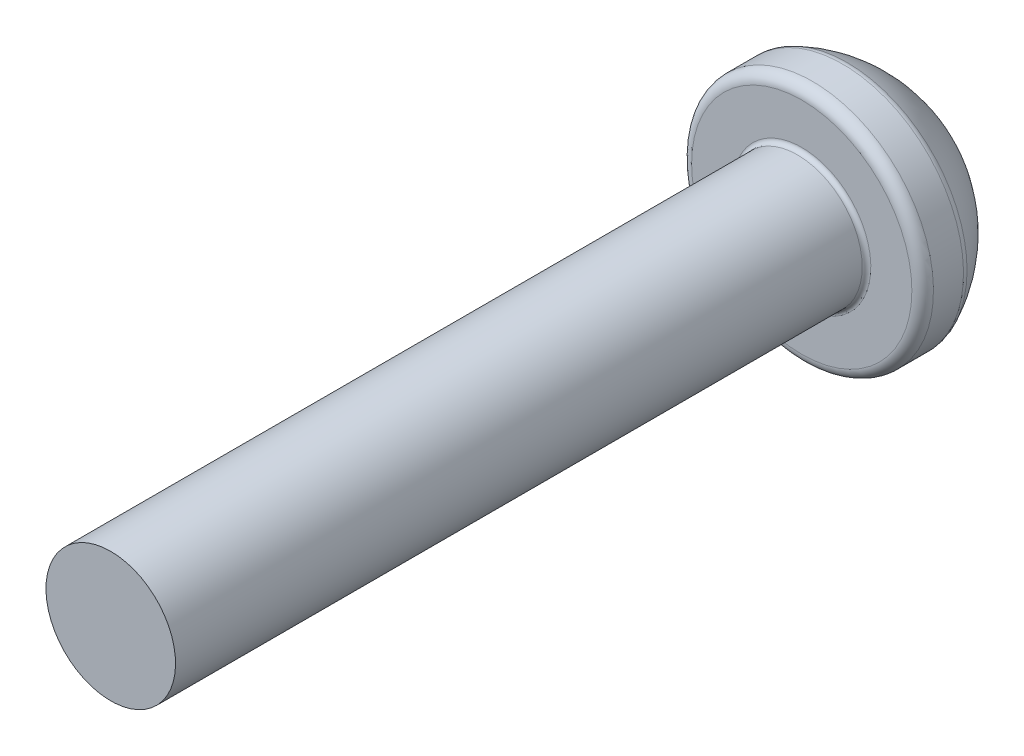
ISO-10303-21;
HEADER;
FILE_DESCRIPTION(('STEP AP214'),'2;1');
FILE_NAME('part.step','',(''),(''),'','','');
FILE_SCHEMA(('AUTOMOTIVE_DESIGN { 1 0 10303 214 1 1 1 1 }'));
ENDSEC;
DATA;
#1=APPLICATION_CONTEXT('core data for automotive mechanical design processes');
#2=APPLICATION_PROTOCOL_DEFINITION('international standard','automotive_design',2000,#1);
#3=PRODUCT_CONTEXT('',#1,'mechanical');
#4=PRODUCT('Part','Part','',(#3));
#5=PRODUCT_RELATED_PRODUCT_CATEGORY('part','',(#4));
#6=PRODUCT_DEFINITION_FORMATION('','',#4);
#7=PRODUCT_DEFINITION_CONTEXT('part definition',#1,'design');
#8=PRODUCT_DEFINITION('design','',#6,#7);
#9=PRODUCT_DEFINITION_SHAPE('','',#8);
#10=(LENGTH_UNIT() NAMED_UNIT(*) SI_UNIT(.MILLI.,.METRE.));
#11=(NAMED_UNIT(*) PLANE_ANGLE_UNIT() SI_UNIT($,.RADIAN.));
#12=(NAMED_UNIT(*) SI_UNIT($,.STERADIAN.) SOLID_ANGLE_UNIT());
#13=UNCERTAINTY_MEASURE_WITH_UNIT(LENGTH_MEASURE(1.E-05),#10,'distance_accuracy_value','');
#14=(GEOMETRIC_REPRESENTATION_CONTEXT(3) GLOBAL_UNCERTAINTY_ASSIGNED_CONTEXT((#13)) GLOBAL_UNIT_ASSIGNED_CONTEXT((#10,
#11,#12)) REPRESENTATION_CONTEXT('',''));
#15=CARTESIAN_POINT('',(0.,0.,0.));
#16=DIRECTION('',(0.,0.,1.));
#17=DIRECTION('',(1.,0.,0.));
#18=AXIS2_PLACEMENT_3D('',#15,#16,#17);
#19=CARTESIAN_POINT('',(0.,0.,16.));
#20=DIRECTION('',(0.,0.,1.));
#21=DIRECTION('',(0.,-1.,0.));
#22=AXIS2_PLACEMENT_3D('',#19,#20,#21);
#23=PLANE('',#22);
#24=CARTESIAN_POINT('',(0.,0.,16.));
#25=DIRECTION('',(0.,0.,-1.));
#26=DIRECTION('',(0.,1.,0.));
#27=AXIS2_PLACEMENT_3D('',#24,#25,#26);
#28=CIRCLE('',#27,1.5);
#29=CARTESIAN_POINT('',(0.,1.5,16.));
#30=VERTEX_POINT('',#29);
#31=EDGE_CURVE('E266',#30,#30,#28,.T.);
#32=ORIENTED_EDGE('',*,*,#31,.F.);
#33=EDGE_LOOP('',(#32));
#34=FACE_BOUND('',#33,.T.);
#35=ADVANCED_FACE('F34',(#34),#23,.T.);
#36=CARTESIAN_POINT('',(0.,0.,-2.4));
#37=DIRECTION('',(0.,0.,-1.));
#38=DIRECTION('',(0.,1.,0.));
#39=AXIS2_PLACEMENT_3D('',#36,#37,#38);
#40=CYLINDRICAL_SURFACE('',#39,1.5);
#41=CARTESIAN_POINT('',(0.,0.,0.0999999999999998));
#42=DIRECTION('',(0.,0.,1.));
#43=DIRECTION('',(0.,-1.,0.));
#44=AXIS2_PLACEMENT_3D('',#41,#42,#43);
#45=CIRCLE('',#44,1.5);
#46=CARTESIAN_POINT('',(0.,-1.5,0.0999999999999997));
#47=VERTEX_POINT('',#46);
#48=EDGE_CURVE('E272',#47,#47,#45,.T.);
#49=ORIENTED_EDGE('',*,*,#48,.T.);
#50=EDGE_LOOP('',(#49));
#51=FACE_BOUND('',#50,.T.);
#52=ORIENTED_EDGE('',*,*,#31,.T.);
#53=EDGE_LOOP('',(#52));
#54=FACE_BOUND('',#53,.T.);
#55=ADVANCED_FACE('F307',(#51,#54),#40,.T.);
#56=CARTESIAN_POINT('',(0.,1.5,0.));
#57=DIRECTION('',(0.,0.,1.));
#58=DIRECTION('',(0.,-1.,0.));
#59=AXIS2_PLACEMENT_3D('',#56,#57,#58);
#60=PLANE('',#59);
#61=CARTESIAN_POINT('',(0.,0.,0.));
#62=DIRECTION('',(0.,0.,1.));
#63=DIRECTION('',(0.,-1.,0.));
#64=AXIS2_PLACEMENT_3D('',#61,#62,#63);
#65=CIRCLE('',#64,2.55);
#66=CARTESIAN_POINT('',(0.,-2.55,0.));
#67=VERTEX_POINT('',#66);
#68=EDGE_CURVE('E11',#67,#67,#65,.T.);
#69=ORIENTED_EDGE('',*,*,#68,.T.);
#70=EDGE_LOOP('',(#69));
#71=FACE_BOUND('',#70,.T.);
#72=CARTESIAN_POINT('',(0.,0.,0.));
#73=DIRECTION('',(0.,0.,1.));
#74=DIRECTION('',(0.,-1.,0.));
#75=AXIS2_PLACEMENT_3D('',#72,#73,#74);
#76=CIRCLE('',#75,1.6);
#77=CARTESIAN_POINT('',(0.,-1.6,0.));
#78=VERTEX_POINT('',#77);
#79=EDGE_CURVE('E269',#78,#78,#76,.F.);
#80=ORIENTED_EDGE('',*,*,#79,.T.);
#81=EDGE_LOOP('',(#80));
#82=FACE_BOUND('',#81,.T.);
#83=ADVANCED_FACE('F312',(#71,#82),#60,.T.);
#84=CARTESIAN_POINT('',(0.,0.,-2.4));
#85=DIRECTION('',(0.,0.,-1.));
#86=DIRECTION('',(0.,1.,0.));
#87=AXIS2_PLACEMENT_3D('',#84,#85,#86);
#88=CYLINDRICAL_SURFACE('',#87,2.8);
#89=CARTESIAN_POINT('',(0.,0.,-0.945424841825028));
#90=DIRECTION('',(0.,0.,1.));
#91=DIRECTION('',(0.,-1.,0.));
#92=AXIS2_PLACEMENT_3D('',#89,#90,#91);
#93=CIRCLE('',#92,2.8);
#94=CARTESIAN_POINT('',(0.,-2.8,-0.945424841825028));
#95=VERTEX_POINT('',#94);
#96=EDGE_CURVE('E41',#95,#95,#93,.T.);
#97=ORIENTED_EDGE('',*,*,#96,.T.);
#98=EDGE_LOOP('',(#97));
#99=FACE_BOUND('',#98,.T.);
#100=CARTESIAN_POINT('',(0.,0.,-0.25));
#101=DIRECTION('',(0.,0.,1.));
#102=DIRECTION('',(0.,-1.,0.));
#103=AXIS2_PLACEMENT_3D('',#100,#101,#102);
#104=CIRCLE('',#103,2.8);
#105=CARTESIAN_POINT('',(0.,-2.8,-0.25));
#106=VERTEX_POINT('',#105);
#107=EDGE_CURVE('E278',#106,#106,#104,.F.);
#108=ORIENTED_EDGE('',*,*,#107,.T.);
#109=EDGE_LOOP('',(#108));
#110=FACE_BOUND('',#109,.T.);
#111=ADVANCED_FACE('F283',(#99,#110),#88,.T.);
#112=CARTESIAN_POINT('',(0.,0.,0.253));
#113=DIRECTION('',(0.,0.,-1.));
#114=DIRECTION('',(0.,1.,0.));
#115=AXIS2_PLACEMENT_3D('',#112,#113,#114);
#116=SPHERICAL_SURFACE('',#115,3.06757379699332);
#117=CARTESIAN_POINT('',(0.,0.,-1.05175966463463));
#118=DIRECTION('',(0.,0.,1.));
#119=DIRECTION('',(0.,-1.,0.));
#120=AXIS2_PLACEMENT_3D('',#117,#118,#119);
#121=CIRCLE('',#120,2.77625849256558);
#122=CARTESIAN_POINT('',(0.,2.77625849256558,-1.05175966463463));
#123=VERTEX_POINT('',#122);
#124=EDGE_CURVE('E275',#123,#123,#121,.F.);
#125=CARTESIAN_POINT('',(0.,0.,-2.4));
#126=DIRECTION('',(0.,0.,-1.));
#127=DIRECTION('',(0.,1.,0.));
#128=AXIS2_PLACEMENT_3D('',#125,#126,#127);
#129=CIRCLE('',#128,1.54);
#130=CARTESIAN_POINT('',(0.,1.54,-2.4));
#131=VERTEX_POINT('',#130);
#132=EDGE_CURVE('E262',#131,#131,#129,.T.);
#133=CARTESIAN_POINT('',(0.,2.77625849256558,-1.05175966463463));
#134=CARTESIAN_POINT('',(0.,2.76802873560929,-1.06927093928298));
#135=CARTESIAN_POINT('',(0.,2.7596332585651,-1.08670432952202));
#136=CARTESIAN_POINT('',(0.,2.74251396302794,-1.12140914487731));
#137=CARTESIAN_POINT('',(0.,2.73379014453496,-1.13868056999355));
#138=CARTESIAN_POINT('',(0.,2.71601726482717,-1.17305525879907));
#139=CARTESIAN_POINT('',(0.,2.70696820361237,-1.19015852248834));
#140=CARTESIAN_POINT('',(0.,2.68854808514226,-1.22419076788491));
#141=CARTESIAN_POINT('',(0.,2.67917702788695,-1.24111974959221));
#142=CARTESIAN_POINT('',(0.,2.66011627086747,-1.27479736870806));
#143=CARTESIAN_POINT('',(0.,2.6504265711033,-1.2915460061166));
#144=CARTESIAN_POINT('',(0.,2.63073199894964,-1.32485694000622));
#145=CARTESIAN_POINT('',(0.,2.62072712656015,-1.34141923648728));
#146=CARTESIAN_POINT('',(0.,2.60040579128121,-1.37435155831383));
#147=CARTESIAN_POINT('',(0.,2.59008932839177,-1.3907215836593));
#148=CARTESIAN_POINT('',(0.,2.56914850596593,-1.4232635019295));
#149=CARTESIAN_POINT('',(0.,2.55852414642954,-1.43943539485421));
#150=CARTESIAN_POINT('',(0.,2.53697133476196,-1.47157525791774));
#151=CARTESIAN_POINT('',(0.,2.52604288263078,-1.48754322805656));
#152=CARTESIAN_POINT('',(0.,2.50388579871807,-1.51926952820363));
#153=CARTESIAN_POINT('',(0.,2.49265716693653,-1.53502785821189));
#154=CARTESIAN_POINT('',(0.,2.46990374414403,-1.56632923581349));
#155=CARTESIAN_POINT('',(0.,2.45837895313307,-1.58187228340683));
#156=CARTESIAN_POINT('',(0.,2.43503733834351,-1.6127375309767));
#157=CARTESIAN_POINT('',(0.,2.42322051456492,-1.62805973095323));
#158=CARTESIAN_POINT('',(0.,2.39929906526431,-1.65847779716217));
#159=CARTESIAN_POINT('',(0.,2.38719443974229,-1.67357366339459));
#160=CARTESIAN_POINT('',(0.,2.36270172102674,-1.703533657027));
#161=CARTESIAN_POINT('',(0.,2.3503136278332,-1.718397784427));
#162=CARTESIAN_POINT('',(0.,2.32525840934237,-1.74788897828058));
#163=CARTESIAN_POINT('',(0.,2.31259128404507,-1.76251604473417));
#164=CARTESIAN_POINT('',(0.,2.28698253682217,-1.79152787946083));
#165=CARTESIAN_POINT('',(0.,2.27404091489656,-1.80591264773389));
#166=CARTESIAN_POINT('',(0.,2.24788780817623,-1.83443473562045));
#167=CARTESIAN_POINT('',(0.,2.23467632338151,-1.84857205523394));
#168=CARTESIAN_POINT('',(0.,2.20798822130683,-1.87659418392154));
#169=CARTESIAN_POINT('',(0.,2.19451160402685,-1.89047899299564));
#170=CARTESIAN_POINT('',(0.,2.16729806229642,-1.91799112913625));
#171=CARTESIAN_POINT('',(0.,2.15356113784596,-1.93161845620276));
#172=CARTESIAN_POINT('',(0.,2.12583190029254,-1.95861074905163));
#173=CARTESIAN_POINT('',(0.,2.11183958718958,-1.971975714834));
#174=CARTESIAN_POINT('',(0.,2.08360458229127,-1.99843849977674));
#175=CARTESIAN_POINT('',(0.,2.06936189049592,-2.0115363189371));
#176=CARTESIAN_POINT('',(0.,2.04063122782128,-2.03746012095011));
#177=CARTESIAN_POINT('',(0.,2.02614325694199,-2.05028610380276));
#178=CARTESIAN_POINT('',(0.,1.99692722353021,-2.07566164084562));
#179=CARTESIAN_POINT('',(0.,1.98219916099771,-2.08821119503583));
#180=CARTESIAN_POINT('',(0.,1.95250821767573,-2.11302938137545));
#181=CARTESIAN_POINT('',(0.,1.93754533688625,-2.12529801352486));
#182=CARTESIAN_POINT('',(0.,1.90739011452162,-2.14954996298589));
#183=CARTESIAN_POINT('',(0.,1.89219777294648,-2.16153328029752));
#184=CARTESIAN_POINT('',(0.,1.86158906864721,-2.18521030945437));
#185=CARTESIAN_POINT('',(0.,1.84617270592309,-2.19690402129959));
#186=CARTESIAN_POINT('',(0.,1.81512147914839,-2.21999765254702));
#187=CARTESIAN_POINT('',(0.,1.79948661509781,-2.23139757194922));
#188=CARTESIAN_POINT('',(0.,1.76800398382114,-2.25389953668146));
#189=CARTESIAN_POINT('',(0.,1.75215621659505,-2.2650015820115));
#190=CARTESIAN_POINT('',(0.,1.72025345299826,-2.2869038230465));
#191=CARTESIAN_POINT('',(0.,1.70419845662755,-2.29770401875144));
#192=CARTESIAN_POINT('',(0.,1.67188698427808,-2.31899869521752));
#193=CARTESIAN_POINT('',(0.,1.65563050829932,-2.32949317597865));
#194=CARTESIAN_POINT('',(0.,1.62292189353214,-2.350172658651));
#195=CARTESIAN_POINT('',(0.,1.60646975474373,-2.36035766056221));
#196=CARTESIAN_POINT('',(0.,1.57337571941818,-2.38041456247664));
#197=CARTESIAN_POINT('',(0.,1.55673382288104,-2.39028646247984));
#198=CARTESIAN_POINT('',(0.,1.54,-2.4));
#199=B_SPLINE_CURVE_WITH_KNOTS('',3,(#133,#134,#135,#136,#137,#138,#139,#140,#141,#142,#143,
#144,#145,#146,#147,#148,#149,#150,#151,#152,#153,#154,#155,#156,#157,#158,#159,#160,#161,#162,
#163,#164,#165,#166,#167,#168,#169,#170,#171,#172,#173,#174,#175,#176,#177,#178,#179,#180,#181,
#182,#183,#184,#185,#186,#187,#188,#189,#190,#191,#192,#193,#194,#195,#196,#197,#198),
.UNSPECIFIED.,.F.,.F.,(4,2,2,2,2,2,2,2,2,2,2,2,2,2,2,2,2,2,2,2,2,2,2,2,2,2,2,2,2,2,2,2,4),(0.,
0.0580453449347516,0.116090689869503,0.174136034804255,0.232181379739006,0.290226724673758,
0.348272069608509,0.406317414543261,0.464362759478013,0.522408104412765,0.580453449347516,
0.638498794282268,0.69654413921702,0.754589484151771,0.812634829086522,0.870680174021274,
0.928725518956026,0.986770863890777,1.04481620882553,1.10286155376028,1.16090689869503,
1.21895224362978,1.27699758856454,1.33504293349929,1.39308827843404,1.45113362336879,
1.50917896830354,1.56722431323829,1.62526965817305,1.6833150031078,1.74136034804255,
1.7994056929773,1.85745103791205),.UNSPECIFIED.);
#200=EDGE_CURVE('BSEAM294',#123,#131,#199,.T.);
#201=ORIENTED_EDGE('',*,*,#124,.T.);
#202=ORIENTED_EDGE('',*,*,#132,.F.);
#203=ORIENTED_EDGE('',*,*,#200,.T.);
#204=ORIENTED_EDGE('',*,*,#200,.F.);
#205=EDGE_LOOP('',(#201,#203,#202,#204));
#206=FACE_BOUND('',#205,.T.);
#207=ADVANCED_FACE('F294',(#206),#116,.T.);
#208=CARTESIAN_POINT('',(0.,0.,-2.4));
#209=DIRECTION('',(0.,0.,-1.));
#210=DIRECTION('',(0.,1.,0.));
#211=AXIS2_PLACEMENT_3D('',#208,#209,#210);
#212=PLANE('',#211);
#213=CARTESIAN_POINT('',(0.,0.,-2.4));
#214=DIRECTION('',(0.,0.,-1.));
#215=DIRECTION('',(0.,1.,0.));
#216=AXIS2_PLACEMENT_3D('',#213,#214,#215);
#217=CIRCLE('',#216,1.4);
#218=CARTESIAN_POINT('',(0.217707917147366,-1.38296900283823,-2.4));
#219=VERTEX_POINT('',#218);
#220=CARTESIAN_POINT('',(-0.217707917147365,-1.38296900283823,-2.4));
#221=VERTEX_POINT('',#220);
#222=EDGE_CURVE('E185',#219,#221,#217,.T.);
#223=ORIENTED_EDGE('',*,*,#222,.F.);
#224=CARTESIAN_POINT('',(0.807500000000003,-1.39863102711187,-2.4));
#225=DIRECTION('',(0.,0.,1.));
#226=DIRECTION('',(0.,1.,0.));
#227=AXIS2_PLACEMENT_3D('',#224,#225,#226);
#228=CIRCLE('',#227,0.59);
#229=CARTESIAN_POINT('',(1.08883233053066,-0.880025088273724,-2.4));
#230=VERTEX_POINT('',#229);
#231=EDGE_CURVE('E183',#230,#219,#228,.T.);
#232=ORIENTED_EDGE('',*,*,#231,.F.);
#233=CARTESIAN_POINT('',(0.,0.,-2.4));
#234=DIRECTION('',(0.,0.,-1.));
#235=DIRECTION('',(0.,1.,0.));
#236=AXIS2_PLACEMENT_3D('',#233,#234,#235);
#237=CIRCLE('',#236,1.4);
#238=CARTESIAN_POINT('',(1.30654024767802,-0.502943914564499,-2.4));
#239=VERTEX_POINT('',#238);
#240=EDGE_CURVE('E180',#239,#230,#237,.T.);
#241=ORIENTED_EDGE('',*,*,#240,.F.);
#242=CARTESIAN_POINT('',(1.615,0.,-2.4));
#243=DIRECTION('',(0.,0.,1.));
#244=DIRECTION('',(0.,1.,0.));
#245=AXIS2_PLACEMENT_3D('',#242,#243,#244);
#246=CIRCLE('',#245,0.59);
#247=CARTESIAN_POINT('',(1.30654024767802,0.502943914564499,-2.4));
#248=VERTEX_POINT('',#247);
#249=EDGE_CURVE('E178',#248,#239,#246,.T.);
#250=ORIENTED_EDGE('',*,*,#249,.F.);
#251=CARTESIAN_POINT('',(0.,0.,-2.4));
#252=DIRECTION('',(0.,0.,-1.));
#253=DIRECTION('',(0.,1.,0.));
#254=AXIS2_PLACEMENT_3D('',#251,#252,#253);
#255=CIRCLE('',#254,1.4);
#256=CARTESIAN_POINT('',(1.08883233053065,0.880025088273735,-2.4));
#257=VERTEX_POINT('',#256);
#258=EDGE_CURVE('E175',#257,#248,#255,.T.);
#259=ORIENTED_EDGE('',*,*,#258,.F.);
#260=CARTESIAN_POINT('',(0.80749999999999,1.39863102711187,-2.4));
#261=DIRECTION('',(0.,0.,1.));
#262=DIRECTION('',(0.,1.,0.));
#263=AXIS2_PLACEMENT_3D('',#260,#261,#262);
#264=CIRCLE('',#263,0.59);
#265=CARTESIAN_POINT('',(0.217707917147354,1.38296900283823,-2.4));
#266=VERTEX_POINT('',#265);
#267=EDGE_CURVE('E170',#266,#257,#264,.T.);
#268=ORIENTED_EDGE('',*,*,#267,.F.);
#269=CARTESIAN_POINT('',(0.,0.,-2.4));
#270=DIRECTION('',(0.,0.,-1.));
#271=DIRECTION('',(0.,1.,0.));
#272=AXIS2_PLACEMENT_3D('',#269,#270,#271);
#273=CIRCLE('',#272,1.4);
#274=CARTESIAN_POINT('',(-0.217707917147376,1.38296900283822,-2.4));
#275=VERTEX_POINT('',#274);
#276=EDGE_CURVE('E168',#275,#266,#273,.T.);
#277=ORIENTED_EDGE('',*,*,#276,.F.);
#278=CARTESIAN_POINT('',(-0.807500000000012,1.39863102711186,-2.4));
#279=DIRECTION('',(0.,0.,1.));
#280=DIRECTION('',(0.,1.,0.));
#281=AXIS2_PLACEMENT_3D('',#278,#279,#280);
#282=CIRCLE('',#281,0.59);
#283=CARTESIAN_POINT('',(-1.08883233053066,0.880025088273718,-2.4));
#284=VERTEX_POINT('',#283);
#285=EDGE_CURVE('E149',#284,#275,#282,.T.);
#286=ORIENTED_EDGE('',*,*,#285,.F.);
#287=CARTESIAN_POINT('',(0.,0.,-2.4));
#288=DIRECTION('',(0.,0.,-1.));
#289=DIRECTION('',(0.,1.,0.));
#290=AXIS2_PLACEMENT_3D('',#287,#288,#289);
#291=CIRCLE('',#290,1.4);
#292=CARTESIAN_POINT('',(-1.30654024767802,0.502943914564499,-2.4));
#293=VERTEX_POINT('',#292);
#294=EDGE_CURVE('E158',#293,#284,#291,.T.);
#295=ORIENTED_EDGE('',*,*,#294,.F.);
#296=CARTESIAN_POINT('',(-1.615,0.,-2.4));
#297=DIRECTION('',(0.,0.,1.));
#298=DIRECTION('',(0.,1.,0.));
#299=AXIS2_PLACEMENT_3D('',#296,#297,#298);
#300=CIRCLE('',#299,0.59);
#301=CARTESIAN_POINT('',(-1.30654024767802,-0.502943914564499,-2.4));
#302=VERTEX_POINT('',#301);
#303=EDGE_CURVE('E161',#302,#293,#300,.T.);
#304=ORIENTED_EDGE('',*,*,#303,.F.);
#305=CARTESIAN_POINT('',(0.,0.,-2.4));
#306=DIRECTION('',(0.,0.,-1.));
#307=DIRECTION('',(0.,1.,0.));
#308=AXIS2_PLACEMENT_3D('',#305,#306,#307);
#309=CIRCLE('',#308,1.4);
#310=CARTESIAN_POINT('',(-1.08883233053066,-0.880025088273725,-2.4));
#311=VERTEX_POINT('',#310);
#312=EDGE_CURVE('E190',#311,#302,#309,.T.);
#313=ORIENTED_EDGE('',*,*,#312,.F.);
#314=CARTESIAN_POINT('',(-0.807500000000002,-1.39863102711187,-2.4));
#315=DIRECTION('',(0.,0.,1.));
#316=DIRECTION('',(0.,1.,0.));
#317=AXIS2_PLACEMENT_3D('',#314,#315,#316);
#318=CIRCLE('',#317,0.59);
#319=EDGE_CURVE('E188',#221,#311,#318,.T.);
#320=ORIENTED_EDGE('',*,*,#319,.F.);
#321=EDGE_LOOP('',(#223,#232,#241,#250,#259,#268,#277,#286,#295,#304,#313,#320));
#322=FACE_BOUND('',#321,.T.);
#323=ORIENTED_EDGE('',*,*,#132,.T.);
#324=EDGE_LOOP('',(#323));
#325=FACE_BOUND('',#324,.T.);
#326=ADVANCED_FACE('F165',(#322,#325),#212,.T.);
#327=CARTESIAN_POINT('',(0.,0.,0.0999999999999998));
#328=DIRECTION('',(0.,0.,1.));
#329=DIRECTION('',(0.,-1.,0.));
#330=AXIS2_PLACEMENT_3D('',#327,#328,#329);
#331=TOROIDAL_SURFACE('',#330,1.6,0.1);
#332=ORIENTED_EDGE('',*,*,#48,.F.);
#333=EDGE_LOOP('',(#332));
#334=FACE_BOUND('',#333,.T.);
#335=ORIENTED_EDGE('',*,*,#79,.F.);
#336=EDGE_LOOP('',(#335));
#337=FACE_BOUND('',#336,.T.);
#338=ADVANCED_FACE('F290',(#334,#337),#331,.F.);
#339=CARTESIAN_POINT('',(0.,0.,-0.945424841825028));
#340=DIRECTION('',(0.,0.,1.));
#341=DIRECTION('',(0.,-1.,0.));
#342=AXIS2_PLACEMENT_3D('',#339,#340,#341);
#343=TOROIDAL_SURFACE('',#342,2.55,0.25);
#344=ORIENTED_EDGE('',*,*,#96,.F.);
#345=EDGE_LOOP('',(#344));
#346=FACE_BOUND('',#345,.T.);
#347=ORIENTED_EDGE('',*,*,#124,.F.);
#348=EDGE_LOOP('',(#347));
#349=FACE_BOUND('',#348,.T.);
#350=ADVANCED_FACE('F286',(#346,#349),#343,.T.);
#351=CARTESIAN_POINT('',(0.,0.,-0.25));
#352=DIRECTION('',(0.,0.,1.));
#353=DIRECTION('',(0.,-1.,0.));
#354=AXIS2_PLACEMENT_3D('',#351,#352,#353);
#355=TOROIDAL_SURFACE('',#354,2.55,0.25);
#356=ORIENTED_EDGE('',*,*,#68,.F.);
#357=EDGE_LOOP('',(#356));
#358=FACE_BOUND('',#357,.T.);
#359=ORIENTED_EDGE('',*,*,#107,.F.);
#360=EDGE_LOOP('',(#359));
#361=FACE_BOUND('',#360,.T.);
#362=ADVANCED_FACE('F289',(#358,#361),#355,.T.);
#363=CARTESIAN_POINT('',(-1.615,0.,-1.4));
#364=DIRECTION('',(0.,0.,-1.));
#365=DIRECTION('',(0.,1.,0.));
#366=AXIS2_PLACEMENT_3D('',#363,#364,#365);
#367=CYLINDRICAL_SURFACE('',#366,0.59);
#368=CARTESIAN_POINT('',(-1.615,0.,-1.4));
#369=DIRECTION('',(0.,0.,1.));
#370=DIRECTION('',(0.,1.,0.));
#371=AXIS2_PLACEMENT_3D('',#368,#369,#370);
#372=CIRCLE('',#371,0.59);
#373=CARTESIAN_POINT('',(-1.30654024767802,-0.502943914564499,-1.4));
#374=VERTEX_POINT('',#373);
#375=CARTESIAN_POINT('',(-1.025,0.,-1.4));
#376=VERTEX_POINT('',#375);
#377=EDGE_CURVE('E194',#374,#376,#372,.T.);
#378=ORIENTED_EDGE('',*,*,#377,.F.);
#379=DIRECTION('',(0.,0.,-1.));
#380=VECTOR('',#379,1.);
#381=CARTESIAN_POINT('',(-1.30654024767802,-0.502943914564499,-1.4));
#382=LINE('',#381,#380);
#383=EDGE_CURVE('E229',#374,#302,#382,.T.);
#384=ORIENTED_EDGE('',*,*,#383,.T.);
#385=ORIENTED_EDGE('',*,*,#303,.T.);
#386=DIRECTION('',(0.,0.,-1.));
#387=VECTOR('',#386,1.);
#388=CARTESIAN_POINT('',(-1.30654024767802,0.502943914564499,-1.4));
#389=LINE('',#388,#387);
#390=CARTESIAN_POINT('',(-1.30654024767802,0.502943914564499,-1.4));
#391=VERTEX_POINT('',#390);
#392=EDGE_CURVE('E48',#391,#293,#389,.T.);
#393=ORIENTED_EDGE('',*,*,#392,.F.);
#394=EDGE_CURVE('E193',#376,#391,#372,.T.);
#395=ORIENTED_EDGE('',*,*,#394,.F.);
#396=EDGE_LOOP('',(#378,#384,#385,#393,#395));
#397=FACE_BOUND('',#396,.T.);
#398=ADVANCED_FACE('F356',(#397),#367,.T.);
#399=CARTESIAN_POINT('',(-0.807500000000002,-1.39863102711187,-1.4));
#400=DIRECTION('',(0.,0.,-1.));
#401=DIRECTION('',(0.,1.,0.));
#402=AXIS2_PLACEMENT_3D('',#399,#400,#401);
#403=CYLINDRICAL_SURFACE('',#402,0.59);
#404=CARTESIAN_POINT('',(-0.807500000000002,-1.39863102711187,-1.4));
#405=DIRECTION('',(0.,0.,1.));
#406=DIRECTION('',(0.,1.,0.));
#407=AXIS2_PLACEMENT_3D('',#404,#405,#406);
#408=CIRCLE('',#407,0.59);
#409=CARTESIAN_POINT('',(-0.217707917147365,-1.38296900283823,-1.4));
#410=VERTEX_POINT('',#409);
#411=CARTESIAN_POINT('',(-0.512500000000001,-0.887676038879049,-1.4));
#412=VERTEX_POINT('',#411);
#413=EDGE_CURVE('E223',#410,#412,#408,.T.);
#414=ORIENTED_EDGE('',*,*,#413,.F.);
#415=DIRECTION('',(0.,0.,-1.));
#416=VECTOR('',#415,1.);
#417=CARTESIAN_POINT('',(-0.217707917147365,-1.38296900283823,-1.4));
#418=LINE('',#417,#416);
#419=EDGE_CURVE('E236',#410,#221,#418,.T.);
#420=ORIENTED_EDGE('',*,*,#419,.T.);
#421=ORIENTED_EDGE('',*,*,#319,.T.);
#422=DIRECTION('',(0.,0.,-1.));
#423=VECTOR('',#422,1.);
#424=CARTESIAN_POINT('',(-1.08883233053066,-0.880025088273726,-1.4));
#425=LINE('',#424,#423);
#426=CARTESIAN_POINT('',(-1.08883233053066,-0.880025088273726,-1.4));
#427=VERTEX_POINT('',#426);
#428=EDGE_CURVE('E233',#427,#311,#425,.T.);
#429=ORIENTED_EDGE('',*,*,#428,.F.);
#430=EDGE_CURVE('E222',#412,#427,#408,.T.);
#431=ORIENTED_EDGE('',*,*,#430,.F.);
#432=EDGE_LOOP('',(#414,#420,#421,#429,#431));
#433=FACE_BOUND('',#432,.T.);
#434=ADVANCED_FACE('F367',(#433),#403,.T.);
#435=CARTESIAN_POINT('',(0.807500000000003,-1.39863102711187,-1.4));
#436=DIRECTION('',(0.,0.,-1.));
#437=DIRECTION('',(0.,1.,0.));
#438=AXIS2_PLACEMENT_3D('',#435,#436,#437);
#439=CYLINDRICAL_SURFACE('',#438,0.59);
#440=CARTESIAN_POINT('',(0.807500000000003,-1.39863102711187,-1.4));
#441=DIRECTION('',(0.,0.,1.));
#442=DIRECTION('',(0.,1.,0.));
#443=AXIS2_PLACEMENT_3D('',#440,#441,#442);
#444=CIRCLE('',#443,0.59);
#445=CARTESIAN_POINT('',(1.08883233053066,-0.880025088273724,-1.4));
#446=VERTEX_POINT('',#445);
#447=CARTESIAN_POINT('',(0.512500000000002,-0.887676038879048,-1.4));
#448=VERTEX_POINT('',#447);
#449=EDGE_CURVE('E216',#446,#448,#444,.T.);
#450=ORIENTED_EDGE('',*,*,#449,.F.);
#451=DIRECTION('',(0.,0.,-1.));
#452=VECTOR('',#451,1.);
#453=CARTESIAN_POINT('',(1.08883233053066,-0.880025088273724,-1.4));
#454=LINE('',#453,#452);
#455=EDGE_CURVE('E242',#446,#230,#454,.T.);
#456=ORIENTED_EDGE('',*,*,#455,.T.);
#457=ORIENTED_EDGE('',*,*,#231,.T.);
#458=DIRECTION('',(0.,0.,-1.));
#459=VECTOR('',#458,1.);
#460=CARTESIAN_POINT('',(0.217707917147366,-1.38296900283823,-1.4));
#461=LINE('',#460,#459);
#462=CARTESIAN_POINT('',(0.217707917147366,-1.38296900283823,-1.4));
#463=VERTEX_POINT('',#462);
#464=EDGE_CURVE('E239',#463,#219,#461,.T.);
#465=ORIENTED_EDGE('',*,*,#464,.F.);
#466=EDGE_CURVE('E215',#448,#463,#444,.T.);
#467=ORIENTED_EDGE('',*,*,#466,.F.);
#468=EDGE_LOOP('',(#450,#456,#457,#465,#467));
#469=FACE_BOUND('',#468,.T.);
#470=ADVANCED_FACE('F377',(#469),#439,.T.);
#471=CARTESIAN_POINT('',(1.615,0.,-1.4));
#472=DIRECTION('',(0.,0.,-1.));
#473=DIRECTION('',(0.,1.,0.));
#474=AXIS2_PLACEMENT_3D('',#471,#472,#473);
#475=CYLINDRICAL_SURFACE('',#474,0.59);
#476=CARTESIAN_POINT('',(1.615,0.,-1.4));
#477=DIRECTION('',(0.,0.,1.));
#478=DIRECTION('',(0.,1.,0.));
#479=AXIS2_PLACEMENT_3D('',#476,#477,#478);
#480=CIRCLE('',#479,0.59);
#481=CARTESIAN_POINT('',(1.30654024767802,0.502943914564499,-1.4));
#482=VERTEX_POINT('',#481);
#483=CARTESIAN_POINT('',(1.025,0.,-1.4));
#484=VERTEX_POINT('',#483);
#485=EDGE_CURVE('E209',#482,#484,#480,.T.);
#486=ORIENTED_EDGE('',*,*,#485,.F.);
#487=DIRECTION('',(0.,0.,-1.));
#488=VECTOR('',#487,1.);
#489=CARTESIAN_POINT('',(1.30654024767802,0.502943914564499,-1.4));
#490=LINE('',#489,#488);
#491=EDGE_CURVE('E248',#482,#248,#490,.T.);
#492=ORIENTED_EDGE('',*,*,#491,.T.);
#493=ORIENTED_EDGE('',*,*,#249,.T.);
#494=DIRECTION('',(0.,0.,-1.));
#495=VECTOR('',#494,1.);
#496=CARTESIAN_POINT('',(1.30654024767802,-0.502943914564499,-1.4));
#497=LINE('',#496,#495);
#498=CARTESIAN_POINT('',(1.30654024767802,-0.502943914564499,-1.4));
#499=VERTEX_POINT('',#498);
#500=EDGE_CURVE('E245',#499,#239,#497,.T.);
#501=ORIENTED_EDGE('',*,*,#500,.F.);
#502=EDGE_CURVE('E208',#484,#499,#480,.T.);
#503=ORIENTED_EDGE('',*,*,#502,.F.);
#504=EDGE_LOOP('',(#486,#492,#493,#501,#503));
#505=FACE_BOUND('',#504,.T.);
#506=ADVANCED_FACE('F387',(#505),#475,.T.);
#507=CARTESIAN_POINT('',(0.80749999999999,1.39863102711187,-1.4));
#508=DIRECTION('',(0.,0.,-1.));
#509=DIRECTION('',(0.,1.,0.));
#510=AXIS2_PLACEMENT_3D('',#507,#508,#509);
#511=CYLINDRICAL_SURFACE('',#510,0.59);
#512=CARTESIAN_POINT('',(0.80749999999999,1.39863102711187,-1.4));
#513=DIRECTION('',(0.,0.,1.));
#514=DIRECTION('',(0.,1.,0.));
#515=AXIS2_PLACEMENT_3D('',#512,#513,#514);
#516=CIRCLE('',#515,0.59);
#517=CARTESIAN_POINT('',(0.217707917147354,1.38296900283823,-1.4));
#518=VERTEX_POINT('',#517);
#519=CARTESIAN_POINT('',(0.512499999999994,0.887676038879053,-1.4));
#520=VERTEX_POINT('',#519);
#521=EDGE_CURVE('E56',#518,#520,#516,.T.);
#522=ORIENTED_EDGE('',*,*,#521,.F.);
#523=DIRECTION('',(0.,0.,-1.));
#524=VECTOR('',#523,1.);
#525=CARTESIAN_POINT('',(0.217707917147354,1.38296900283823,-1.4));
#526=LINE('',#525,#524);
#527=EDGE_CURVE('E254',#518,#266,#526,.T.);
#528=ORIENTED_EDGE('',*,*,#527,.T.);
#529=ORIENTED_EDGE('',*,*,#267,.T.);
#530=DIRECTION('',(0.,0.,-1.));
#531=VECTOR('',#530,1.);
#532=CARTESIAN_POINT('',(1.08883233053065,0.880025088273735,-1.4));
#533=LINE('',#532,#531);
#534=CARTESIAN_POINT('',(1.08883233053065,0.880025088273735,-1.4));
#535=VERTEX_POINT('',#534);
#536=EDGE_CURVE('E251',#535,#257,#533,.T.);
#537=ORIENTED_EDGE('',*,*,#536,.F.);
#538=EDGE_CURVE('E203',#520,#535,#516,.T.);
#539=ORIENTED_EDGE('',*,*,#538,.F.);
#540=EDGE_LOOP('',(#522,#528,#529,#537,#539));
#541=FACE_BOUND('',#540,.T.);
#542=ADVANCED_FACE('F397',(#541),#511,.T.);
#543=CARTESIAN_POINT('',(-0.807500000000012,1.39863102711186,-1.4));
#544=DIRECTION('',(0.,0.,-1.));
#545=DIRECTION('',(0.,1.,0.));
#546=AXIS2_PLACEMENT_3D('',#543,#544,#545);
#547=CYLINDRICAL_SURFACE('',#546,0.59);
#548=CARTESIAN_POINT('',(-0.807500000000012,1.39863102711186,-1.4));
#549=DIRECTION('',(0.,0.,1.));
#550=DIRECTION('',(0.,1.,0.));
#551=AXIS2_PLACEMENT_3D('',#548,#549,#550);
#552=CIRCLE('',#551,0.59);
#553=CARTESIAN_POINT('',(-1.08883233053066,0.880025088273717,-1.4));
#554=VERTEX_POINT('',#553);
#555=CARTESIAN_POINT('',(-0.512500000000008,0.887676038879045,-1.4));
#556=VERTEX_POINT('',#555);
#557=EDGE_CURVE('E153',#554,#556,#552,.T.);
#558=ORIENTED_EDGE('',*,*,#557,.F.);
#559=DIRECTION('',(0.,0.,-1.));
#560=VECTOR('',#559,1.);
#561=CARTESIAN_POINT('',(-1.08883233053066,0.880025088273717,-1.4));
#562=LINE('',#561,#560);
#563=EDGE_CURVE('E145',#554,#284,#562,.T.);
#564=ORIENTED_EDGE('',*,*,#563,.T.);
#565=ORIENTED_EDGE('',*,*,#285,.T.);
#566=DIRECTION('',(0.,0.,-1.));
#567=VECTOR('',#566,1.);
#568=CARTESIAN_POINT('',(-0.217707917147376,1.38296900283822,-1.4));
#569=LINE('',#568,#567);
#570=CARTESIAN_POINT('',(-0.217707917147376,1.38296900283822,-1.4));
#571=VERTEX_POINT('',#570);
#572=EDGE_CURVE('E155',#571,#275,#569,.T.);
#573=ORIENTED_EDGE('',*,*,#572,.F.);
#574=EDGE_CURVE('E199',#556,#571,#552,.T.);
#575=ORIENTED_EDGE('',*,*,#574,.F.);
#576=EDGE_LOOP('',(#558,#564,#565,#573,#575));
#577=FACE_BOUND('',#576,.T.);
#578=ADVANCED_FACE('F146',(#577),#547,.T.);
#579=CARTESIAN_POINT('',(-0.8075,0.,-1.4));
#580=DIRECTION('',(0.,0.,-1.));
#581=DIRECTION('',(0.,1.,0.));
#582=AXIS2_PLACEMENT_3D('',#579,#580,#581);
#583=PLANE('',#582);
#584=CARTESIAN_POINT('',(0.,0.,-1.4));
#585=DIRECTION('',(0.,0.,-1.));
#586=DIRECTION('',(0.,1.,0.));
#587=AXIS2_PLACEMENT_3D('',#584,#585,#586);
#588=CIRCLE('',#587,1.025);
#589=EDGE_CURVE('E556',#376,#556,#588,.T.);
#590=ORIENTED_EDGE('',*,*,#589,.F.);
#591=ORIENTED_EDGE('',*,*,#394,.T.);
#592=CARTESIAN_POINT('',(0.,0.,-1.4));
#593=DIRECTION('',(0.,0.,-1.));
#594=DIRECTION('',(0.,1.,0.));
#595=AXIS2_PLACEMENT_3D('',#592,#593,#594);
#596=CIRCLE('',#595,1.4);
#597=EDGE_CURVE('E197',#391,#554,#596,.T.);
#598=ORIENTED_EDGE('',*,*,#597,.T.);
#599=ORIENTED_EDGE('',*,*,#557,.T.);
#600=EDGE_LOOP('',(#590,#591,#598,#599));
#601=FACE_BOUND('',#600,.T.);
#602=ADVANCED_FACE('F416',(#601),#583,.T.);
#603=EDGE_CURVE('E554',#412,#376,#588,.T.);
#604=ORIENTED_EDGE('',*,*,#603,.F.);
#605=ORIENTED_EDGE('',*,*,#430,.T.);
#606=CARTESIAN_POINT('',(0.,0.,-1.4));
#607=DIRECTION('',(0.,0.,-1.));
#608=DIRECTION('',(0.,1.,0.));
#609=AXIS2_PLACEMENT_3D('',#606,#607,#608);
#610=CIRCLE('',#609,1.4);
#611=EDGE_CURVE('E226',#427,#374,#610,.T.);
#612=ORIENTED_EDGE('',*,*,#611,.T.);
#613=ORIENTED_EDGE('',*,*,#377,.T.);
#614=EDGE_LOOP('',(#604,#605,#612,#613));
#615=FACE_BOUND('',#614,.T.);
#616=ADVANCED_FACE('F425',(#615),#583,.T.);
#617=EDGE_CURVE('E553',#448,#412,#588,.T.);
#618=ORIENTED_EDGE('',*,*,#617,.F.);
#619=ORIENTED_EDGE('',*,*,#466,.T.);
#620=CARTESIAN_POINT('',(0.,0.,-1.4));
#621=DIRECTION('',(0.,0.,-1.));
#622=DIRECTION('',(0.,1.,0.));
#623=AXIS2_PLACEMENT_3D('',#620,#621,#622);
#624=CIRCLE('',#623,1.4);
#625=EDGE_CURVE('E219',#463,#410,#624,.T.);
#626=ORIENTED_EDGE('',*,*,#625,.T.);
#627=ORIENTED_EDGE('',*,*,#413,.T.);
#628=EDGE_LOOP('',(#618,#619,#626,#627));
#629=FACE_BOUND('',#628,.T.);
#630=ADVANCED_FACE('F436',(#629),#583,.T.);
#631=EDGE_CURVE('E263',#484,#448,#588,.T.);
#632=ORIENTED_EDGE('',*,*,#631,.F.);
#633=ORIENTED_EDGE('',*,*,#502,.T.);
#634=CARTESIAN_POINT('',(0.,0.,-1.4));
#635=DIRECTION('',(0.,0.,-1.));
#636=DIRECTION('',(0.,1.,0.));
#637=AXIS2_PLACEMENT_3D('',#634,#635,#636);
#638=CIRCLE('',#637,1.4);
#639=EDGE_CURVE('E212',#499,#446,#638,.T.);
#640=ORIENTED_EDGE('',*,*,#639,.T.);
#641=ORIENTED_EDGE('',*,*,#449,.T.);
#642=EDGE_LOOP('',(#632,#633,#640,#641));
#643=FACE_BOUND('',#642,.T.);
#644=ADVANCED_FACE('F445',(#643),#583,.T.);
#645=EDGE_CURVE('E259',#520,#484,#588,.T.);
#646=ORIENTED_EDGE('',*,*,#645,.F.);
#647=ORIENTED_EDGE('',*,*,#538,.T.);
#648=CARTESIAN_POINT('',(0.,0.,-1.4));
#649=DIRECTION('',(0.,0.,-1.));
#650=DIRECTION('',(0.,1.,0.));
#651=AXIS2_PLACEMENT_3D('',#648,#649,#650);
#652=CIRCLE('',#651,1.4);
#653=EDGE_CURVE('E205',#535,#482,#652,.T.);
#654=ORIENTED_EDGE('',*,*,#653,.T.);
#655=ORIENTED_EDGE('',*,*,#485,.T.);
#656=EDGE_LOOP('',(#646,#647,#654,#655));
#657=FACE_BOUND('',#656,.T.);
#658=ADVANCED_FACE('F454',(#657),#583,.T.);
#659=EDGE_CURVE('E232',#556,#520,#588,.T.);
#660=ORIENTED_EDGE('',*,*,#659,.F.);
#661=ORIENTED_EDGE('',*,*,#574,.T.);
#662=CARTESIAN_POINT('',(0.,0.,-1.4));
#663=DIRECTION('',(0.,0.,-1.));
#664=DIRECTION('',(0.,1.,0.));
#665=AXIS2_PLACEMENT_3D('',#662,#663,#664);
#666=CIRCLE('',#665,1.4);
#667=EDGE_CURVE('E201',#571,#518,#666,.T.);
#668=ORIENTED_EDGE('',*,*,#667,.T.);
#669=ORIENTED_EDGE('',*,*,#521,.T.);
#670=EDGE_LOOP('',(#660,#661,#668,#669));
#671=FACE_BOUND('',#670,.T.);
#672=ADVANCED_FACE('F428',(#671),#583,.T.);
#673=CARTESIAN_POINT('',(0.,0.,-1.4));
#674=DIRECTION('',(0.,0.,-1.));
#675=DIRECTION('',(0.,1.,0.));
#676=AXIS2_PLACEMENT_3D('',#673,#674,#675);
#677=CYLINDRICAL_SURFACE('',#676,1.4);
#678=ORIENTED_EDGE('',*,*,#312,.T.);
#679=ORIENTED_EDGE('',*,*,#383,.F.);
#680=ORIENTED_EDGE('',*,*,#611,.F.);
#681=ORIENTED_EDGE('',*,*,#428,.T.);
#682=EDGE_LOOP('',(#678,#679,#680,#681));
#683=FACE_BOUND('',#682,.T.);
#684=ADVANCED_FACE('F471',(#683),#677,.F.);
#685=CARTESIAN_POINT('',(0.,0.,-1.4));
#686=DIRECTION('',(0.,0.,-1.));
#687=DIRECTION('',(0.,1.,0.));
#688=AXIS2_PLACEMENT_3D('',#685,#686,#687);
#689=CYLINDRICAL_SURFACE('',#688,1.4);
#690=ORIENTED_EDGE('',*,*,#222,.T.);
#691=ORIENTED_EDGE('',*,*,#419,.F.);
#692=ORIENTED_EDGE('',*,*,#625,.F.);
#693=ORIENTED_EDGE('',*,*,#464,.T.);
#694=EDGE_LOOP('',(#690,#691,#692,#693));
#695=FACE_BOUND('',#694,.T.);
#696=ADVANCED_FACE('F479',(#695),#689,.F.);
#697=CARTESIAN_POINT('',(0.,0.,-1.4));
#698=DIRECTION('',(0.,0.,-1.));
#699=DIRECTION('',(0.,1.,0.));
#700=AXIS2_PLACEMENT_3D('',#697,#698,#699);
#701=CYLINDRICAL_SURFACE('',#700,1.4);
#702=ORIENTED_EDGE('',*,*,#240,.T.);
#703=ORIENTED_EDGE('',*,*,#455,.F.);
#704=ORIENTED_EDGE('',*,*,#639,.F.);
#705=ORIENTED_EDGE('',*,*,#500,.T.);
#706=EDGE_LOOP('',(#702,#703,#704,#705));
#707=FACE_BOUND('',#706,.T.);
#708=ADVANCED_FACE('F489',(#707),#701,.F.);
#709=CARTESIAN_POINT('',(0.,0.,-1.4));
#710=DIRECTION('',(0.,0.,-1.));
#711=DIRECTION('',(0.,1.,0.));
#712=AXIS2_PLACEMENT_3D('',#709,#710,#711);
#713=CYLINDRICAL_SURFACE('',#712,1.4);
#714=ORIENTED_EDGE('',*,*,#258,.T.);
#715=ORIENTED_EDGE('',*,*,#491,.F.);
#716=ORIENTED_EDGE('',*,*,#653,.F.);
#717=ORIENTED_EDGE('',*,*,#536,.T.);
#718=EDGE_LOOP('',(#714,#715,#716,#717));
#719=FACE_BOUND('',#718,.T.);
#720=ADVANCED_FACE('F499',(#719),#713,.F.);
#721=CARTESIAN_POINT('',(0.,0.,-1.4));
#722=DIRECTION('',(0.,0.,-1.));
#723=DIRECTION('',(0.,1.,0.));
#724=AXIS2_PLACEMENT_3D('',#721,#722,#723);
#725=CYLINDRICAL_SURFACE('',#724,1.4);
#726=ORIENTED_EDGE('',*,*,#276,.T.);
#727=ORIENTED_EDGE('',*,*,#527,.F.);
#728=ORIENTED_EDGE('',*,*,#667,.F.);
#729=ORIENTED_EDGE('',*,*,#572,.T.);
#730=EDGE_LOOP('',(#726,#727,#728,#729));
#731=FACE_BOUND('',#730,.T.);
#732=ADVANCED_FACE('F509',(#731),#725,.F.);
#733=CARTESIAN_POINT('',(0.,0.,-1.4));
#734=DIRECTION('',(0.,0.,-1.));
#735=DIRECTION('',(0.,1.,0.));
#736=AXIS2_PLACEMENT_3D('',#733,#734,#735);
#737=CYLINDRICAL_SURFACE('',#736,1.4);
#738=ORIENTED_EDGE('',*,*,#294,.T.);
#739=ORIENTED_EDGE('',*,*,#563,.F.);
#740=ORIENTED_EDGE('',*,*,#597,.F.);
#741=ORIENTED_EDGE('',*,*,#392,.T.);
#742=EDGE_LOOP('',(#738,#739,#740,#741));
#743=FACE_BOUND('',#742,.T.);
#744=ADVANCED_FACE('F159',(#743),#737,.F.);
#745=CARTESIAN_POINT('',(0.,0.,-1.4));
#746=DIRECTION('',(0.,0.,-1.));
#747=DIRECTION('',(0.,1.,0.));
#748=AXIS2_PLACEMENT_3D('',#745,#746,#747);
#749=CONICAL_SURFACE('',#748,1.025,1.22173047639603);
#750=CARTESIAN_POINT('',(0.,0.,-1.02693050987715));
#751=VERTEX_POINT('',#750);
#752=VERTEX_LOOP('',#751);
#753=FACE_BOUND('',#752,.T.);
#754=ORIENTED_EDGE('',*,*,#645,.T.);
#755=ORIENTED_EDGE('',*,*,#631,.T.);
#756=ORIENTED_EDGE('',*,*,#617,.T.);
#757=ORIENTED_EDGE('',*,*,#603,.T.);
#758=ORIENTED_EDGE('',*,*,#589,.T.);
#759=ORIENTED_EDGE('',*,*,#659,.T.);
#760=EDGE_LOOP('',(#754,#755,#756,#757,#758,#759));
#761=FACE_BOUND('',#760,.T.);
#762=ADVANCED_FACE('F528',(#753,#761),#749,.F.);
#763=CLOSED_SHELL('',(#35,#55,#83,#111,#207,#326,#338,#350,#362,#398,#434,#470,#506,#542,#578,
#602,#616,#630,#644,#658,#672,#684,#696,#708,#720,#732,#744,#762));
#764=MANIFOLD_SOLID_BREP('B2',#763);
#765=ADVANCED_BREP_SHAPE_REPRESENTATION('',(#18,#764),#14);
#766=SHAPE_DEFINITION_REPRESENTATION(#9,#765);
ENDSEC;
END-ISO-10303-21;
